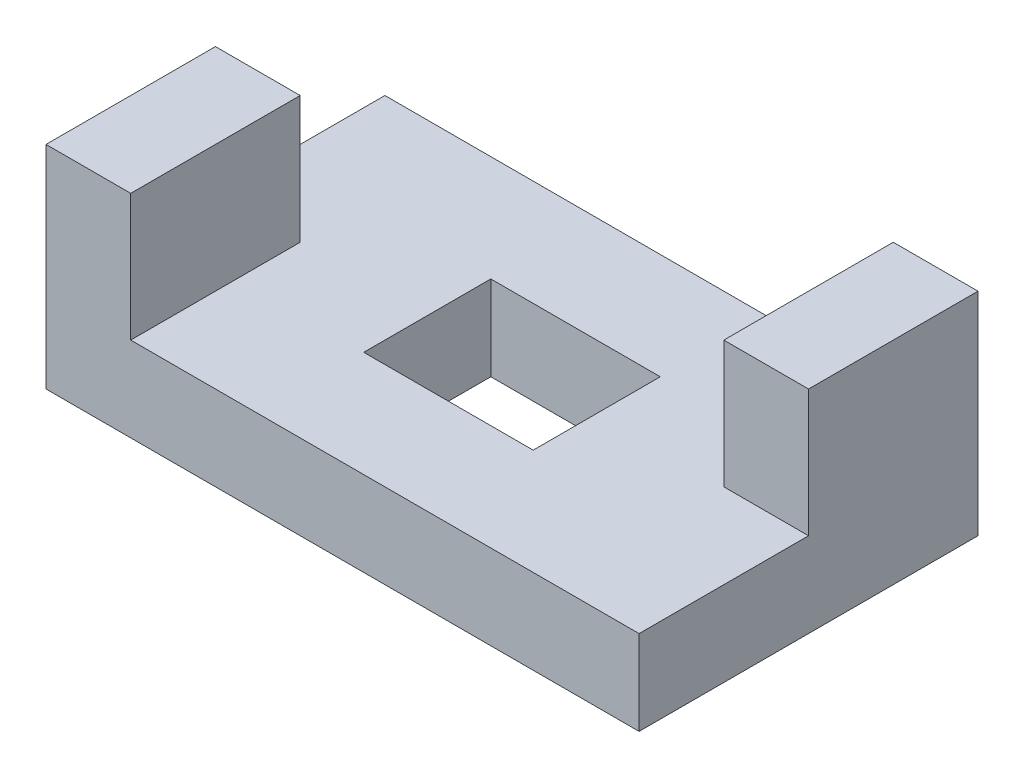
ISO-10303-21;
HEADER;
FILE_DESCRIPTION(('STEP AP214'),'2;1');
FILE_NAME('part.step','',(''),(''),'','','');
FILE_SCHEMA(('AUTOMOTIVE_DESIGN { 1 0 10303 214 1 1 1 1 }'));
ENDSEC;
DATA;
#1=APPLICATION_CONTEXT('core data for automotive mechanical design processes');
#2=APPLICATION_PROTOCOL_DEFINITION('international standard','automotive_design',2000,#1);
#3=PRODUCT_CONTEXT('',#1,'mechanical');
#4=PRODUCT('Part','Part','',(#3));
#5=PRODUCT_RELATED_PRODUCT_CATEGORY('part','',(#4));
#6=PRODUCT_DEFINITION_FORMATION('','',#4);
#7=PRODUCT_DEFINITION_CONTEXT('part definition',#1,'design');
#8=PRODUCT_DEFINITION('design','',#6,#7);
#9=PRODUCT_DEFINITION_SHAPE('','',#8);
#10=(LENGTH_UNIT() NAMED_UNIT(*) SI_UNIT(.MILLI.,.METRE.));
#11=(NAMED_UNIT(*) PLANE_ANGLE_UNIT() SI_UNIT($,.RADIAN.));
#12=(NAMED_UNIT(*) SI_UNIT($,.STERADIAN.) SOLID_ANGLE_UNIT());
#13=UNCERTAINTY_MEASURE_WITH_UNIT(LENGTH_MEASURE(1.E-05),#10,'distance_accuracy_value','');
#14=(GEOMETRIC_REPRESENTATION_CONTEXT(3) GLOBAL_UNCERTAINTY_ASSIGNED_CONTEXT((#13)) GLOBAL_UNIT_ASSIGNED_CONTEXT((#10,
#11,#12)) REPRESENTATION_CONTEXT('',''));
#15=CARTESIAN_POINT('',(0.,0.,0.));
#16=DIRECTION('',(0.,0.,1.));
#17=DIRECTION('',(1.,0.,0.));
#18=AXIS2_PLACEMENT_3D('',#15,#16,#17);
#19=CARTESIAN_POINT('',(0.,16.,0.));
#20=DIRECTION('',(1.,0.,0.));
#21=DIRECTION('',(0.,0.,-1.));
#22=AXIS2_PLACEMENT_3D('',#19,#20,#21);
#23=PLANE('',#22);
#24=DIRECTION('',(0.,0.,1.));
#25=VECTOR('',#24,1.);
#26=CARTESIAN_POINT('',(0.,0.,0.));
#27=LINE('',#26,#25);
#28=CARTESIAN_POINT('',(0.,0.,-64.));
#29=VERTEX_POINT('',#28);
#30=CARTESIAN_POINT('',(0.,0.,0.));
#31=VERTEX_POINT('',#30);
#32=EDGE_CURVE('E214',#29,#31,#27,.T.);
#33=ORIENTED_EDGE('',*,*,#32,.T.);
#34=DIRECTION('',(0.,-1.,0.));
#35=VECTOR('',#34,1.);
#36=CARTESIAN_POINT('',(0.,16.,0.));
#37=LINE('',#36,#35);
#38=CARTESIAN_POINT('',(0.,40.,0.));
#39=VERTEX_POINT('',#38);
#40=EDGE_CURVE('E11',#39,#31,#37,.T.);
#41=ORIENTED_EDGE('',*,*,#40,.F.);
#42=DIRECTION('',(0.,0.,1.));
#43=VECTOR('',#42,1.);
#44=CARTESIAN_POINT('',(0.,40.,-32.));
#45=LINE('',#44,#43);
#46=CARTESIAN_POINT('',(0.,40.,-32.));
#47=VERTEX_POINT('',#46);
#48=EDGE_CURVE('E204',#47,#39,#45,.T.);
#49=ORIENTED_EDGE('',*,*,#48,.F.);
#50=DIRECTION('',(0.,-1.,0.));
#51=VECTOR('',#50,1.);
#52=CARTESIAN_POINT('',(0.,0.,-32.));
#53=LINE('',#52,#51);
#54=CARTESIAN_POINT('',(0.,16.,-32.));
#55=VERTEX_POINT('',#54);
#56=EDGE_CURVE('E191',#47,#55,#53,.T.);
#57=ORIENTED_EDGE('',*,*,#56,.T.);
#58=DIRECTION('',(0.,0.,1.));
#59=VECTOR('',#58,1.);
#60=CARTESIAN_POINT('',(0.,16.,0.));
#61=LINE('',#60,#59);
#62=CARTESIAN_POINT('',(0.,16.,-64.));
#63=VERTEX_POINT('',#62);
#64=EDGE_CURVE('E215',#63,#55,#61,.T.);
#65=ORIENTED_EDGE('',*,*,#64,.F.);
#66=DIRECTION('',(0.,-1.,0.));
#67=VECTOR('',#66,1.);
#68=CARTESIAN_POINT('',(0.,16.,-64.));
#69=LINE('',#68,#67);
#70=EDGE_CURVE('E224',#63,#29,#69,.T.);
#71=ORIENTED_EDGE('',*,*,#70,.T.);
#72=EDGE_LOOP('',(#33,#41,#49,#57,#65,#71));
#73=FACE_BOUND('',#72,.T.);
#74=ADVANCED_FACE('F32',(#73),#23,.F.);
#75=CARTESIAN_POINT('',(0.,16.,0.));
#76=DIRECTION('',(0.,0.,-1.));
#77=DIRECTION('',(-1.,0.,0.));
#78=AXIS2_PLACEMENT_3D('',#75,#76,#77);
#79=PLANE('',#78);
#80=DIRECTION('',(1.,0.,0.));
#81=VECTOR('',#80,1.);
#82=CARTESIAN_POINT('',(0.,16.,0.));
#83=LINE('',#82,#81);
#84=CARTESIAN_POINT('',(16.,16.,0.));
#85=VERTEX_POINT('',#84);
#86=CARTESIAN_POINT('',(112.,16.,0.));
#87=VERTEX_POINT('',#86);
#88=EDGE_CURVE('E217',#85,#87,#83,.T.);
#89=ORIENTED_EDGE('',*,*,#88,.F.);
#90=DIRECTION('',(0.,1.,0.));
#91=VECTOR('',#90,1.);
#92=CARTESIAN_POINT('',(16.,0.,0.));
#93=LINE('',#92,#91);
#94=CARTESIAN_POINT('',(16.,40.,0.));
#95=VERTEX_POINT('',#94);
#96=EDGE_CURVE('E190',#85,#95,#93,.T.);
#97=ORIENTED_EDGE('',*,*,#96,.T.);
#98=DIRECTION('',(-1.,0.,0.));
#99=VECTOR('',#98,1.);
#100=CARTESIAN_POINT('',(0.,40.,0.));
#101=LINE('',#100,#99);
#102=EDGE_CURVE('E195',#95,#39,#101,.T.);
#103=ORIENTED_EDGE('',*,*,#102,.T.);
#104=ORIENTED_EDGE('',*,*,#40,.T.);
#105=DIRECTION('',(1.,0.,0.));
#106=VECTOR('',#105,1.);
#107=CARTESIAN_POINT('',(0.,0.,0.));
#108=LINE('',#107,#106);
#109=CARTESIAN_POINT('',(112.,0.,0.));
#110=VERTEX_POINT('',#109);
#111=EDGE_CURVE('E226',#31,#110,#108,.T.);
#112=ORIENTED_EDGE('',*,*,#111,.T.);
#113=DIRECTION('',(0.,-1.,0.));
#114=VECTOR('',#113,1.);
#115=CARTESIAN_POINT('',(112.,16.,0.));
#116=LINE('',#115,#114);
#117=EDGE_CURVE('E39',#87,#110,#116,.T.);
#118=ORIENTED_EDGE('',*,*,#117,.F.);
#119=EDGE_LOOP('',(#89,#97,#103,#104,#112,#118));
#120=FACE_BOUND('',#119,.T.);
#121=ADVANCED_FACE('F266',(#120),#79,.F.);
#122=CARTESIAN_POINT('',(112.,16.,0.));
#123=DIRECTION('',(-1.,0.,0.));
#124=DIRECTION('',(0.,0.,1.));
#125=AXIS2_PLACEMENT_3D('',#122,#123,#124);
#126=PLANE('',#125);
#127=DIRECTION('',(0.,0.,-1.));
#128=VECTOR('',#127,1.);
#129=CARTESIAN_POINT('',(112.,0.,0.));
#130=LINE('',#129,#128);
#131=CARTESIAN_POINT('',(112.,0.,-64.));
#132=VERTEX_POINT('',#131);
#133=EDGE_CURVE('E228',#110,#132,#130,.T.);
#134=ORIENTED_EDGE('',*,*,#133,.T.);
#135=DIRECTION('',(0.,-1.,0.));
#136=VECTOR('',#135,1.);
#137=CARTESIAN_POINT('',(112.,16.,-64.));
#138=LINE('',#137,#136);
#139=CARTESIAN_POINT('',(112.,40.,-64.));
#140=VERTEX_POINT('',#139);
#141=EDGE_CURVE('E233',#140,#132,#138,.T.);
#142=ORIENTED_EDGE('',*,*,#141,.F.);
#143=DIRECTION('',(0.,0.,-1.));
#144=VECTOR('',#143,1.);
#145=CARTESIAN_POINT('',(112.,40.,-32.));
#146=LINE('',#145,#144);
#147=CARTESIAN_POINT('',(112.,40.,-32.));
#148=VERTEX_POINT('',#147);
#149=EDGE_CURVE('E180',#148,#140,#146,.T.);
#150=ORIENTED_EDGE('',*,*,#149,.F.);
#151=DIRECTION('',(0.,-1.,0.));
#152=VECTOR('',#151,1.);
#153=CARTESIAN_POINT('',(112.,0.,-32.));
#154=LINE('',#153,#152);
#155=CARTESIAN_POINT('',(112.,16.,-32.));
#156=VERTEX_POINT('',#155);
#157=EDGE_CURVE('E167',#148,#156,#154,.T.);
#158=ORIENTED_EDGE('',*,*,#157,.T.);
#159=DIRECTION('',(0.,0.,-1.));
#160=VECTOR('',#159,1.);
#161=CARTESIAN_POINT('',(112.,16.,0.));
#162=LINE('',#161,#160);
#163=EDGE_CURVE('E220',#87,#156,#162,.T.);
#164=ORIENTED_EDGE('',*,*,#163,.F.);
#165=ORIENTED_EDGE('',*,*,#117,.T.);
#166=EDGE_LOOP('',(#134,#142,#150,#158,#164,#165));
#167=FACE_BOUND('',#166,.T.);
#168=ADVANCED_FACE('F240',(#167),#126,.F.);
#169=CARTESIAN_POINT('',(0.,16.,-64.));
#170=DIRECTION('',(0.,0.,1.));
#171=DIRECTION('',(1.,0.,0.));
#172=AXIS2_PLACEMENT_3D('',#169,#170,#171);
#173=PLANE('',#172);
#174=DIRECTION('',(-1.,0.,0.));
#175=VECTOR('',#174,1.);
#176=CARTESIAN_POINT('',(0.,16.,-64.));
#177=LINE('',#176,#175);
#178=CARTESIAN_POINT('',(96.,16.,-64.));
#179=VERTEX_POINT('',#178);
#180=EDGE_CURVE('E222',#179,#63,#177,.T.);
#181=ORIENTED_EDGE('',*,*,#180,.F.);
#182=DIRECTION('',(0.,1.,0.));
#183=VECTOR('',#182,1.);
#184=CARTESIAN_POINT('',(96.,0.,-64.));
#185=LINE('',#184,#183);
#186=CARTESIAN_POINT('',(96.,40.,-64.));
#187=VERTEX_POINT('',#186);
#188=EDGE_CURVE('E138',#179,#187,#185,.T.);
#189=ORIENTED_EDGE('',*,*,#188,.T.);
#190=DIRECTION('',(1.,0.,0.));
#191=VECTOR('',#190,1.);
#192=CARTESIAN_POINT('',(112.,40.,-64.));
#193=LINE('',#192,#191);
#194=EDGE_CURVE('E171',#187,#140,#193,.T.);
#195=ORIENTED_EDGE('',*,*,#194,.T.);
#196=ORIENTED_EDGE('',*,*,#141,.T.);
#197=DIRECTION('',(-1.,0.,0.));
#198=VECTOR('',#197,1.);
#199=CARTESIAN_POINT('',(0.,0.,-64.));
#200=LINE('',#199,#198);
#201=EDGE_CURVE('E218',#132,#29,#200,.T.);
#202=ORIENTED_EDGE('',*,*,#201,.T.);
#203=ORIENTED_EDGE('',*,*,#70,.F.);
#204=EDGE_LOOP('',(#181,#189,#195,#196,#202,#203));
#205=FACE_BOUND('',#204,.T.);
#206=ADVANCED_FACE('F247',(#205),#173,.F.);
#207=CARTESIAN_POINT('',(0.,16.,0.));
#208=DIRECTION('',(0.,-1.,0.));
#209=DIRECTION('',(0.,0.,-1.));
#210=AXIS2_PLACEMENT_3D('',#207,#208,#209);
#211=PLANE('',#210);
#212=DIRECTION('',(-1.,0.,0.));
#213=VECTOR('',#212,1.);
#214=CARTESIAN_POINT('',(40.,16.,-44.));
#215=LINE('',#214,#213);
#216=CARTESIAN_POINT('',(72.,16.,-44.));
#217=VERTEX_POINT('',#216);
#218=CARTESIAN_POINT('',(40.,16.,-44.));
#219=VERTEX_POINT('',#218);
#220=EDGE_CURVE('E151',#217,#219,#215,.T.);
#221=ORIENTED_EDGE('',*,*,#220,.F.);
#222=DIRECTION('',(0.,0.,-1.));
#223=VECTOR('',#222,1.);
#224=CARTESIAN_POINT('',(72.,16.,-44.));
#225=LINE('',#224,#223);
#226=CARTESIAN_POINT('',(72.,16.,-20.));
#227=VERTEX_POINT('',#226);
#228=EDGE_CURVE('E46',#227,#217,#225,.T.);
#229=ORIENTED_EDGE('',*,*,#228,.F.);
#230=DIRECTION('',(1.,0.,0.));
#231=VECTOR('',#230,1.);
#232=CARTESIAN_POINT('',(40.,16.,-20.));
#233=LINE('',#232,#231);
#234=CARTESIAN_POINT('',(40.,16.,-20.));
#235=VERTEX_POINT('',#234);
#236=EDGE_CURVE('E144',#235,#227,#233,.T.);
#237=ORIENTED_EDGE('',*,*,#236,.F.);
#238=DIRECTION('',(0.,0.,1.));
#239=VECTOR('',#238,1.);
#240=CARTESIAN_POINT('',(40.,16.,-44.));
#241=LINE('',#240,#239);
#242=EDGE_CURVE('E158',#219,#235,#241,.T.);
#243=ORIENTED_EDGE('',*,*,#242,.F.);
#244=EDGE_LOOP('',(#221,#229,#237,#243));
#245=FACE_BOUND('',#244,.T.);
#246=DIRECTION('',(-1.,0.,0.));
#247=VECTOR('',#246,1.);
#248=CARTESIAN_POINT('',(0.,16.,-32.));
#249=LINE('',#248,#247);
#250=CARTESIAN_POINT('',(96.,16.,-32.));
#251=VERTEX_POINT('',#250);
#252=EDGE_CURVE('E183',#156,#251,#249,.T.);
#253=ORIENTED_EDGE('',*,*,#252,.T.);
#254=DIRECTION('',(0.,0.,-1.));
#255=VECTOR('',#254,1.);
#256=CARTESIAN_POINT('',(96.,16.,0.));
#257=LINE('',#256,#255);
#258=EDGE_CURVE('E187',#251,#179,#257,.T.);
#259=ORIENTED_EDGE('',*,*,#258,.T.);
#260=ORIENTED_EDGE('',*,*,#180,.T.);
#261=ORIENTED_EDGE('',*,*,#64,.T.);
#262=DIRECTION('',(1.,0.,0.));
#263=VECTOR('',#262,1.);
#264=CARTESIAN_POINT('',(0.,16.,-32.));
#265=LINE('',#264,#263);
#266=CARTESIAN_POINT('',(16.,16.,-32.));
#267=VERTEX_POINT('',#266);
#268=EDGE_CURVE('E207',#55,#267,#265,.T.);
#269=ORIENTED_EDGE('',*,*,#268,.T.);
#270=DIRECTION('',(0.,0.,1.));
#271=VECTOR('',#270,1.);
#272=CARTESIAN_POINT('',(16.,16.,0.));
#273=LINE('',#272,#271);
#274=EDGE_CURVE('E211',#267,#85,#273,.T.);
#275=ORIENTED_EDGE('',*,*,#274,.T.);
#276=ORIENTED_EDGE('',*,*,#88,.T.);
#277=ORIENTED_EDGE('',*,*,#163,.T.);
#278=EDGE_LOOP('',(#253,#259,#260,#261,#269,#275,#276,#277));
#279=FACE_BOUND('',#278,.T.);
#280=ADVANCED_FACE('F253',(#245,#279),#211,.F.);
#281=CARTESIAN_POINT('',(0.,0.,0.));
#282=DIRECTION('',(0.,-1.,0.));
#283=DIRECTION('',(0.,0.,-1.));
#284=AXIS2_PLACEMENT_3D('',#281,#282,#283);
#285=PLANE('',#284);
#286=DIRECTION('',(0.,0.,-1.));
#287=VECTOR('',#286,1.);
#288=CARTESIAN_POINT('',(72.,0.,-44.));
#289=LINE('',#288,#287);
#290=CARTESIAN_POINT('',(72.,0.,-20.));
#291=VERTEX_POINT('',#290);
#292=CARTESIAN_POINT('',(72.,0.,-44.));
#293=VERTEX_POINT('',#292);
#294=EDGE_CURVE('E142',#291,#293,#289,.T.);
#295=ORIENTED_EDGE('',*,*,#294,.T.);
#296=DIRECTION('',(-1.,0.,0.));
#297=VECTOR('',#296,1.);
#298=CARTESIAN_POINT('',(40.,0.,-44.));
#299=LINE('',#298,#297);
#300=CARTESIAN_POINT('',(40.,0.,-44.));
#301=VERTEX_POINT('',#300);
#302=EDGE_CURVE('E131',#293,#301,#299,.T.);
#303=ORIENTED_EDGE('',*,*,#302,.T.);
#304=DIRECTION('',(0.,0.,1.));
#305=VECTOR('',#304,1.);
#306=CARTESIAN_POINT('',(40.,0.,-44.));
#307=LINE('',#306,#305);
#308=CARTESIAN_POINT('',(40.,0.,-20.));
#309=VERTEX_POINT('',#308);
#310=EDGE_CURVE('E153',#301,#309,#307,.T.);
#311=ORIENTED_EDGE('',*,*,#310,.T.);
#312=DIRECTION('',(1.,0.,0.));
#313=VECTOR('',#312,1.);
#314=CARTESIAN_POINT('',(40.,0.,-20.));
#315=LINE('',#314,#313);
#316=EDGE_CURVE('E149',#309,#291,#315,.T.);
#317=ORIENTED_EDGE('',*,*,#316,.T.);
#318=EDGE_LOOP('',(#295,#303,#311,#317));
#319=FACE_BOUND('',#318,.T.);
#320=ORIENTED_EDGE('',*,*,#32,.F.);
#321=ORIENTED_EDGE('',*,*,#201,.F.);
#322=ORIENTED_EDGE('',*,*,#133,.F.);
#323=ORIENTED_EDGE('',*,*,#111,.F.);
#324=EDGE_LOOP('',(#320,#321,#322,#323));
#325=FACE_BOUND('',#324,.T.);
#326=ADVANCED_FACE('F147',(#319,#325),#285,.T.);
#327=CARTESIAN_POINT('',(16.,0.,-32.));
#328=DIRECTION('',(1.,0.,0.));
#329=DIRECTION('',(0.,0.,-1.));
#330=AXIS2_PLACEMENT_3D('',#327,#328,#329);
#331=PLANE('',#330);
#332=ORIENTED_EDGE('',*,*,#274,.F.);
#333=DIRECTION('',(0.,1.,0.));
#334=VECTOR('',#333,1.);
#335=CARTESIAN_POINT('',(16.,0.,-32.));
#336=LINE('',#335,#334);
#337=CARTESIAN_POINT('',(16.,40.,-32.));
#338=VERTEX_POINT('',#337);
#339=EDGE_CURVE('E194',#267,#338,#336,.T.);
#340=ORIENTED_EDGE('',*,*,#339,.T.);
#341=DIRECTION('',(0.,0.,1.));
#342=VECTOR('',#341,1.);
#343=CARTESIAN_POINT('',(16.,40.,-32.));
#344=LINE('',#343,#342);
#345=EDGE_CURVE('E200',#338,#95,#344,.T.);
#346=ORIENTED_EDGE('',*,*,#345,.T.);
#347=ORIENTED_EDGE('',*,*,#96,.F.);
#348=EDGE_LOOP('',(#332,#340,#346,#347));
#349=FACE_BOUND('',#348,.T.);
#350=ADVANCED_FACE('F261',(#349),#331,.T.);
#351=CARTESIAN_POINT('',(0.,0.,-32.));
#352=DIRECTION('',(0.,0.,-1.));
#353=DIRECTION('',(-1.,0.,0.));
#354=AXIS2_PLACEMENT_3D('',#351,#352,#353);
#355=PLANE('',#354);
#356=ORIENTED_EDGE('',*,*,#268,.F.);
#357=ORIENTED_EDGE('',*,*,#56,.F.);
#358=DIRECTION('',(-1.,0.,0.));
#359=VECTOR('',#358,1.);
#360=CARTESIAN_POINT('',(0.,40.,-32.));
#361=LINE('',#360,#359);
#362=EDGE_CURVE('E197',#338,#47,#361,.T.);
#363=ORIENTED_EDGE('',*,*,#362,.F.);
#364=ORIENTED_EDGE('',*,*,#339,.F.);
#365=EDGE_LOOP('',(#356,#357,#363,#364));
#366=FACE_BOUND('',#365,.T.);
#367=ADVANCED_FACE('F257',(#366),#355,.T.);
#368=CARTESIAN_POINT('',(0.,40.,-32.));
#369=DIRECTION('',(0.,1.,0.));
#370=DIRECTION('',(0.,0.,1.));
#371=AXIS2_PLACEMENT_3D('',#368,#369,#370);
#372=PLANE('',#371);
#373=ORIENTED_EDGE('',*,*,#102,.F.);
#374=ORIENTED_EDGE('',*,*,#345,.F.);
#375=ORIENTED_EDGE('',*,*,#362,.T.);
#376=ORIENTED_EDGE('',*,*,#48,.T.);
#377=EDGE_LOOP('',(#373,#374,#375,#376));
#378=FACE_BOUND('',#377,.T.);
#379=ADVANCED_FACE('F265',(#378),#372,.T.);
#380=CARTESIAN_POINT('',(96.,0.,-32.));
#381=DIRECTION('',(-1.,0.,0.));
#382=DIRECTION('',(0.,0.,1.));
#383=AXIS2_PLACEMENT_3D('',#380,#381,#382);
#384=PLANE('',#383);
#385=ORIENTED_EDGE('',*,*,#258,.F.);
#386=DIRECTION('',(0.,1.,0.));
#387=VECTOR('',#386,1.);
#388=CARTESIAN_POINT('',(96.,0.,-32.));
#389=LINE('',#388,#387);
#390=CARTESIAN_POINT('',(96.,40.,-32.));
#391=VERTEX_POINT('',#390);
#392=EDGE_CURVE('E170',#251,#391,#389,.T.);
#393=ORIENTED_EDGE('',*,*,#392,.T.);
#394=DIRECTION('',(0.,0.,-1.));
#395=VECTOR('',#394,1.);
#396=CARTESIAN_POINT('',(96.,40.,-32.));
#397=LINE('',#396,#395);
#398=EDGE_CURVE('E176',#391,#187,#397,.T.);
#399=ORIENTED_EDGE('',*,*,#398,.T.);
#400=ORIENTED_EDGE('',*,*,#188,.F.);
#401=EDGE_LOOP('',(#385,#393,#399,#400));
#402=FACE_BOUND('',#401,.T.);
#403=ADVANCED_FACE('F280',(#402),#384,.T.);
#404=CARTESIAN_POINT('',(0.,0.,-32.));
#405=DIRECTION('',(0.,0.,1.));
#406=DIRECTION('',(1.,0.,0.));
#407=AXIS2_PLACEMENT_3D('',#404,#405,#406);
#408=PLANE('',#407);
#409=ORIENTED_EDGE('',*,*,#252,.F.);
#410=ORIENTED_EDGE('',*,*,#157,.F.);
#411=DIRECTION('',(1.,0.,0.));
#412=VECTOR('',#411,1.);
#413=CARTESIAN_POINT('',(112.,40.,-32.));
#414=LINE('',#413,#412);
#415=EDGE_CURVE('E173',#391,#148,#414,.T.);
#416=ORIENTED_EDGE('',*,*,#415,.F.);
#417=ORIENTED_EDGE('',*,*,#392,.F.);
#418=EDGE_LOOP('',(#409,#410,#416,#417));
#419=FACE_BOUND('',#418,.T.);
#420=ADVANCED_FACE('F272',(#419),#408,.T.);
#421=CARTESIAN_POINT('',(112.,40.,-32.));
#422=DIRECTION('',(0.,1.,0.));
#423=DIRECTION('',(0.,0.,1.));
#424=AXIS2_PLACEMENT_3D('',#421,#422,#423);
#425=PLANE('',#424);
#426=ORIENTED_EDGE('',*,*,#194,.F.);
#427=ORIENTED_EDGE('',*,*,#398,.F.);
#428=ORIENTED_EDGE('',*,*,#415,.T.);
#429=ORIENTED_EDGE('',*,*,#149,.T.);
#430=EDGE_LOOP('',(#426,#427,#428,#429));
#431=FACE_BOUND('',#430,.T.);
#432=ADVANCED_FACE('F276',(#431),#425,.T.);
#433=CARTESIAN_POINT('',(72.,-0.001000000000001,-44.));
#434=DIRECTION('',(1.,0.,0.));
#435=DIRECTION('',(0.,0.,-1.));
#436=AXIS2_PLACEMENT_3D('',#433,#434,#435);
#437=PLANE('',#436);
#438=DIRECTION('',(0.,1.,0.));
#439=VECTOR('',#438,1.);
#440=CARTESIAN_POINT('',(72.,-0.001000000000001,-20.));
#441=LINE('',#440,#439);
#442=EDGE_CURVE('E139',#291,#227,#441,.T.);
#443=ORIENTED_EDGE('',*,*,#442,.T.);
#444=ORIENTED_EDGE('',*,*,#228,.T.);
#445=DIRECTION('',(0.,1.,0.));
#446=VECTOR('',#445,1.);
#447=CARTESIAN_POINT('',(72.,-0.001000000000001,-44.));
#448=LINE('',#447,#446);
#449=EDGE_CURVE('E133',#293,#217,#448,.T.);
#450=ORIENTED_EDGE('',*,*,#449,.F.);
#451=ORIENTED_EDGE('',*,*,#294,.F.);
#452=EDGE_LOOP('',(#443,#444,#450,#451));
#453=FACE_BOUND('',#452,.T.);
#454=ADVANCED_FACE('F141',(#453),#437,.F.);
#455=CARTESIAN_POINT('',(40.,-0.001000000000001,-20.));
#456=DIRECTION('',(0.,0.,1.));
#457=DIRECTION('',(1.,0.,0.));
#458=AXIS2_PLACEMENT_3D('',#455,#456,#457);
#459=PLANE('',#458);
#460=DIRECTION('',(0.,1.,0.));
#461=VECTOR('',#460,1.);
#462=CARTESIAN_POINT('',(40.,-0.001000000000001,-20.));
#463=LINE('',#462,#461);
#464=EDGE_CURVE('E164',#309,#235,#463,.T.);
#465=ORIENTED_EDGE('',*,*,#464,.T.);
#466=ORIENTED_EDGE('',*,*,#236,.T.);
#467=ORIENTED_EDGE('',*,*,#442,.F.);
#468=ORIENTED_EDGE('',*,*,#316,.F.);
#469=EDGE_LOOP('',(#465,#466,#467,#468));
#470=FACE_BOUND('',#469,.T.);
#471=ADVANCED_FACE('F370',(#470),#459,.F.);
#472=CARTESIAN_POINT('',(40.,-0.001000000000001,-44.));
#473=DIRECTION('',(-1.,0.,0.));
#474=DIRECTION('',(0.,0.,1.));
#475=AXIS2_PLACEMENT_3D('',#472,#473,#474);
#476=PLANE('',#475);
#477=DIRECTION('',(0.,1.,0.));
#478=VECTOR('',#477,1.);
#479=CARTESIAN_POINT('',(40.,-0.001000000000001,-44.));
#480=LINE('',#479,#478);
#481=EDGE_CURVE('E54',#301,#219,#480,.T.);
#482=ORIENTED_EDGE('',*,*,#481,.T.);
#483=ORIENTED_EDGE('',*,*,#242,.T.);
#484=ORIENTED_EDGE('',*,*,#464,.F.);
#485=ORIENTED_EDGE('',*,*,#310,.F.);
#486=EDGE_LOOP('',(#482,#483,#484,#485));
#487=FACE_BOUND('',#486,.T.);
#488=ADVANCED_FACE('F379',(#487),#476,.F.);
#489=CARTESIAN_POINT('',(40.,-0.001000000000001,-44.));
#490=DIRECTION('',(0.,0.,-1.));
#491=DIRECTION('',(-1.,0.,0.));
#492=AXIS2_PLACEMENT_3D('',#489,#490,#491);
#493=PLANE('',#492);
#494=ORIENTED_EDGE('',*,*,#449,.T.);
#495=ORIENTED_EDGE('',*,*,#220,.T.);
#496=ORIENTED_EDGE('',*,*,#481,.F.);
#497=ORIENTED_EDGE('',*,*,#302,.F.);
#498=EDGE_LOOP('',(#494,#495,#496,#497));
#499=FACE_BOUND('',#498,.T.);
#500=ADVANCED_FACE('F132',(#499),#493,.F.);
#501=CLOSED_SHELL('',(#74,#121,#168,#206,#280,#326,#350,#367,#379,#403,#420,#432,#454,#471,#488,#500));
#502=MANIFOLD_SOLID_BREP('B2',#501);
#503=ADVANCED_BREP_SHAPE_REPRESENTATION('',(#18,#502),#14);
#504=SHAPE_DEFINITION_REPRESENTATION(#9,#503);
ENDSEC;
END-ISO-10303-21;
